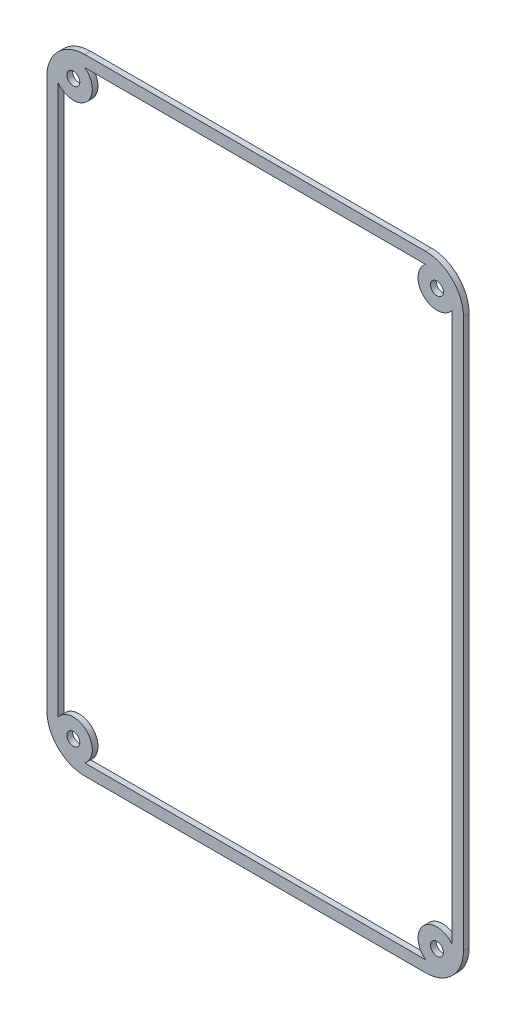
ISO-10303-21;
HEADER;
FILE_DESCRIPTION(('STEP AP214'),'2;1');
FILE_NAME('part.step','',(''),(''),'','','');
FILE_SCHEMA(('AUTOMOTIVE_DESIGN { 1 0 10303 214 1 1 1 1 }'));
ENDSEC;
DATA;
#1=APPLICATION_CONTEXT('core data for automotive mechanical design processes');
#2=APPLICATION_PROTOCOL_DEFINITION('international standard','automotive_design',2000,#1);
#3=PRODUCT_CONTEXT('',#1,'mechanical');
#4=PRODUCT('Part','Part','',(#3));
#5=PRODUCT_RELATED_PRODUCT_CATEGORY('part','',(#4));
#6=PRODUCT_DEFINITION_FORMATION('','',#4);
#7=PRODUCT_DEFINITION_CONTEXT('part definition',#1,'design');
#8=PRODUCT_DEFINITION('design','',#6,#7);
#9=PRODUCT_DEFINITION_SHAPE('','',#8);
#10=(LENGTH_UNIT() NAMED_UNIT(*) SI_UNIT(.MILLI.,.METRE.));
#11=(NAMED_UNIT(*) PLANE_ANGLE_UNIT() SI_UNIT($,.RADIAN.));
#12=(NAMED_UNIT(*) SI_UNIT($,.STERADIAN.) SOLID_ANGLE_UNIT());
#13=UNCERTAINTY_MEASURE_WITH_UNIT(LENGTH_MEASURE(1.E-05),#10,'distance_accuracy_value','');
#14=(GEOMETRIC_REPRESENTATION_CONTEXT(3) GLOBAL_UNCERTAINTY_ASSIGNED_CONTEXT((#13)) GLOBAL_UNIT_ASSIGNED_CONTEXT((#10,
#11,#12)) REPRESENTATION_CONTEXT('',''));
#15=CARTESIAN_POINT('',(0.,0.,0.));
#16=DIRECTION('',(0.,0.,1.));
#17=DIRECTION('',(1.,0.,0.));
#18=AXIS2_PLACEMENT_3D('',#15,#16,#17);
#19=CARTESIAN_POINT('',(-45.,-72.5,1.5));
#20=DIRECTION('',(0.,0.,1.));
#21=DIRECTION('',(1.,0.,0.));
#22=AXIS2_PLACEMENT_3D('',#19,#20,#21);
#23=PLANE('',#22);
#24=CARTESIAN_POINT('',(-48.,75.5,1.5));
#25=DIRECTION('',(0.,0.,1.));
#26=DIRECTION('',(1.,0.,0.));
#27=AXIS2_PLACEMENT_3D('',#24,#25,#26);
#28=CIRCLE('',#27,1.7);
#29=CARTESIAN_POINT('',(-46.3,75.5,1.5));
#30=VERTEX_POINT('',#29);
#31=EDGE_CURVE('E592',#30,#30,#28,.T.);
#32=ORIENTED_EDGE('',*,*,#31,.F.);
#33=EDGE_LOOP('',(#32));
#34=FACE_BOUND('',#33,.T.);
#35=CARTESIAN_POINT('',(48.,-75.5,1.5));
#36=DIRECTION('',(0.,0.,1.));
#37=DIRECTION('',(1.,0.,0.));
#38=AXIS2_PLACEMENT_3D('',#35,#36,#37);
#39=CIRCLE('',#38,1.7);
#40=CARTESIAN_POINT('',(49.7,-75.5,1.5));
#41=VERTEX_POINT('',#40);
#42=EDGE_CURVE('E595',#41,#41,#39,.T.);
#43=ORIENTED_EDGE('',*,*,#42,.F.);
#44=EDGE_LOOP('',(#43));
#45=FACE_BOUND('',#44,.T.);
#46=CARTESIAN_POINT('',(48.,75.5,1.5));
#47=DIRECTION('',(0.,0.,1.));
#48=DIRECTION('',(1.,0.,0.));
#49=AXIS2_PLACEMENT_3D('',#46,#47,#48);
#50=CIRCLE('',#49,1.7);
#51=CARTESIAN_POINT('',(49.7,75.5,1.5));
#52=VERTEX_POINT('',#51);
#53=EDGE_CURVE('E605',#52,#52,#50,.T.);
#54=ORIENTED_EDGE('',*,*,#53,.F.);
#55=EDGE_LOOP('',(#54));
#56=FACE_BOUND('',#55,.T.);
#57=CARTESIAN_POINT('',(-48.,-75.5,1.5));
#58=DIRECTION('',(0.,0.,1.));
#59=DIRECTION('',(1.,0.,0.));
#60=AXIS2_PLACEMENT_3D('',#57,#58,#59);
#61=CIRCLE('',#60,1.7);
#62=CARTESIAN_POINT('',(-46.3,-75.5,1.5));
#63=VERTEX_POINT('',#62);
#64=EDGE_CURVE('E185',#63,#63,#61,.T.);
#65=ORIENTED_EDGE('',*,*,#64,.F.);
#66=EDGE_LOOP('',(#65));
#67=FACE_BOUND('',#66,.T.);
#68=CARTESIAN_POINT('',(-45.,-72.5,1.5));
#69=DIRECTION('',(0.,0.,1.));
#70=DIRECTION('',(1.,0.,0.));
#71=AXIS2_PLACEMENT_3D('',#68,#69,#70);
#72=CIRCLE('',#71,10.);
#73=CARTESIAN_POINT('',(-55.,-72.5,1.5));
#74=VERTEX_POINT('',#73);
#75=CARTESIAN_POINT('',(-45.,-82.5,1.5));
#76=VERTEX_POINT('',#75);
#77=EDGE_CURVE('E226',#74,#76,#72,.T.);
#78=ORIENTED_EDGE('',*,*,#77,.T.);
#79=DIRECTION('',(1.,0.,0.));
#80=VECTOR('',#79,1.);
#81=CARTESIAN_POINT('',(-45.,-82.5,1.5));
#82=LINE('',#81,#80);
#83=CARTESIAN_POINT('',(45.,-82.5,1.5));
#84=VERTEX_POINT('',#83);
#85=EDGE_CURVE('E229',#76,#84,#82,.T.);
#86=ORIENTED_EDGE('',*,*,#85,.T.);
#87=CARTESIAN_POINT('',(45.,-72.5,1.5));
#88=DIRECTION('',(0.,0.,1.));
#89=DIRECTION('',(1.,0.,0.));
#90=AXIS2_PLACEMENT_3D('',#87,#88,#89);
#91=CIRCLE('',#90,10.);
#92=CARTESIAN_POINT('',(55.,-72.5,1.5));
#93=VERTEX_POINT('',#92);
#94=EDGE_CURVE('E232',#84,#93,#91,.T.);
#95=ORIENTED_EDGE('',*,*,#94,.T.);
#96=DIRECTION('',(0.,1.,0.));
#97=VECTOR('',#96,1.);
#98=CARTESIAN_POINT('',(55.,-72.5,1.5));
#99=LINE('',#98,#97);
#100=CARTESIAN_POINT('',(55.,72.5,1.5));
#101=VERTEX_POINT('',#100);
#102=EDGE_CURVE('E234',#93,#101,#99,.T.);
#103=ORIENTED_EDGE('',*,*,#102,.T.);
#104=CARTESIAN_POINT('',(45.,72.5,1.5));
#105=DIRECTION('',(0.,0.,1.));
#106=DIRECTION('',(1.,0.,0.));
#107=AXIS2_PLACEMENT_3D('',#104,#105,#106);
#108=CIRCLE('',#107,10.);
#109=CARTESIAN_POINT('',(45.,82.5,1.5));
#110=VERTEX_POINT('',#109);
#111=EDGE_CURVE('E236',#101,#110,#108,.T.);
#112=ORIENTED_EDGE('',*,*,#111,.T.);
#113=DIRECTION('',(-1.,0.,0.));
#114=VECTOR('',#113,1.);
#115=CARTESIAN_POINT('',(45.,82.5,1.5));
#116=LINE('',#115,#114);
#117=CARTESIAN_POINT('',(-45.,82.5,1.5));
#118=VERTEX_POINT('',#117);
#119=EDGE_CURVE('E238',#110,#118,#116,.T.);
#120=ORIENTED_EDGE('',*,*,#119,.T.);
#121=CARTESIAN_POINT('',(-45.,72.5,1.5));
#122=DIRECTION('',(0.,0.,1.));
#123=DIRECTION('',(1.,0.,0.));
#124=AXIS2_PLACEMENT_3D('',#121,#122,#123);
#125=CIRCLE('',#124,10.);
#126=CARTESIAN_POINT('',(-55.,72.5,1.5));
#127=VERTEX_POINT('',#126);
#128=EDGE_CURVE('E240',#118,#127,#125,.T.);
#129=ORIENTED_EDGE('',*,*,#128,.T.);
#130=DIRECTION('',(0.,-1.,0.));
#131=VECTOR('',#130,1.);
#132=CARTESIAN_POINT('',(-55.,72.5,1.5));
#133=LINE('',#132,#131);
#134=EDGE_CURVE('E242',#127,#74,#133,.T.);
#135=ORIENTED_EDGE('',*,*,#134,.T.);
#136=EDGE_LOOP('',(#78,#86,#95,#103,#112,#120,#129,#135));
#137=FACE_BOUND('',#136,.T.);
#138=DIRECTION('',(-1.,0.,0.));
#139=VECTOR('',#138,1.);
#140=CARTESIAN_POINT('',(45.,79.5,1.5));
#141=LINE('',#140,#139);
#142=CARTESIAN_POINT('',(45.,79.5,1.5));
#143=VERTEX_POINT('',#142);
#144=CARTESIAN_POINT('',(-45.,79.5,1.5));
#145=VERTEX_POINT('',#144);
#146=EDGE_CURVE('E204',#143,#145,#141,.T.);
#147=ORIENTED_EDGE('',*,*,#146,.F.);
#148=CARTESIAN_POINT('',(48.,75.5,1.5));
#149=DIRECTION('',(0.,0.,1.));
#150=DIRECTION('',(1.,0.,0.));
#151=AXIS2_PLACEMENT_3D('',#148,#149,#150);
#152=CIRCLE('',#151,5.);
#153=CARTESIAN_POINT('',(52.,72.5,1.5));
#154=VERTEX_POINT('',#153);
#155=EDGE_CURVE('E170',#143,#154,#152,.T.);
#156=ORIENTED_EDGE('',*,*,#155,.T.);
#157=DIRECTION('',(0.,1.,0.));
#158=VECTOR('',#157,1.);
#159=CARTESIAN_POINT('',(52.,-72.5,1.5));
#160=LINE('',#159,#158);
#161=CARTESIAN_POINT('',(52.,-72.5,1.5));
#162=VERTEX_POINT('',#161);
#163=EDGE_CURVE('E202',#162,#154,#160,.T.);
#164=ORIENTED_EDGE('',*,*,#163,.F.);
#165=CARTESIAN_POINT('',(48.,-75.5,1.5));
#166=DIRECTION('',(0.,0.,1.));
#167=DIRECTION('',(1.,0.,0.));
#168=AXIS2_PLACEMENT_3D('',#165,#166,#167);
#169=CIRCLE('',#168,5.);
#170=CARTESIAN_POINT('',(45.,-79.5,1.5));
#171=VERTEX_POINT('',#170);
#172=EDGE_CURVE('E177',#162,#171,#169,.T.);
#173=ORIENTED_EDGE('',*,*,#172,.T.);
#174=DIRECTION('',(1.,0.,0.));
#175=VECTOR('',#174,1.);
#176=CARTESIAN_POINT('',(-45.,-79.5,1.5));
#177=LINE('',#176,#175);
#178=CARTESIAN_POINT('',(-45.,-79.5,1.5));
#179=VERTEX_POINT('',#178);
#180=EDGE_CURVE('E200',#179,#171,#177,.T.);
#181=ORIENTED_EDGE('',*,*,#180,.F.);
#182=CARTESIAN_POINT('',(-48.,-75.5,1.5));
#183=DIRECTION('',(0.,0.,1.));
#184=DIRECTION('',(1.,0.,0.));
#185=AXIS2_PLACEMENT_3D('',#182,#183,#184);
#186=CIRCLE('',#185,5.);
#187=CARTESIAN_POINT('',(-52.,-72.5,1.5));
#188=VERTEX_POINT('',#187);
#189=EDGE_CURVE('E195',#179,#188,#186,.T.);
#190=ORIENTED_EDGE('',*,*,#189,.T.);
#191=DIRECTION('',(0.,-1.,0.));
#192=VECTOR('',#191,1.);
#193=CARTESIAN_POINT('',(-52.,72.5,1.5));
#194=LINE('',#193,#192);
#195=CARTESIAN_POINT('',(-52.,72.5,1.5));
#196=VERTEX_POINT('',#195);
#197=EDGE_CURVE('E206',#196,#188,#194,.T.);
#198=ORIENTED_EDGE('',*,*,#197,.F.);
#199=CARTESIAN_POINT('',(-48.,75.5,1.5));
#200=DIRECTION('',(0.,0.,1.));
#201=DIRECTION('',(1.,0.,0.));
#202=AXIS2_PLACEMENT_3D('',#199,#200,#201);
#203=CIRCLE('',#202,5.);
#204=EDGE_CURVE('E189',#196,#145,#203,.T.);
#205=ORIENTED_EDGE('',*,*,#204,.T.);
#206=EDGE_LOOP('',(#147,#156,#164,#173,#181,#190,#198,#205));
#207=FACE_BOUND('',#206,.T.);
#208=ADVANCED_FACE('F36',(#34,#45,#56,#67,#137,#207),#23,.T.);
#209=CARTESIAN_POINT('',(-45.,-72.5,0.));
#210=DIRECTION('',(0.,0.,1.));
#211=DIRECTION('',(1.,0.,0.));
#212=AXIS2_PLACEMENT_3D('',#209,#210,#211);
#213=PLANE('',#212);
#214=CARTESIAN_POINT('',(-48.,75.5,0.));
#215=DIRECTION('',(0.,0.,1.));
#216=DIRECTION('',(1.,0.,0.));
#217=AXIS2_PLACEMENT_3D('',#214,#215,#216);
#218=CIRCLE('',#217,1.7);
#219=CARTESIAN_POINT('',(-46.3,75.5,0.));
#220=VERTEX_POINT('',#219);
#221=EDGE_CURVE('E590',#220,#220,#218,.T.);
#222=ORIENTED_EDGE('',*,*,#221,.T.);
#223=EDGE_LOOP('',(#222));
#224=FACE_BOUND('',#223,.T.);
#225=CARTESIAN_POINT('',(48.,-75.5,0.));
#226=DIRECTION('',(0.,0.,1.));
#227=DIRECTION('',(1.,0.,0.));
#228=AXIS2_PLACEMENT_3D('',#225,#226,#227);
#229=CIRCLE('',#228,1.7);
#230=CARTESIAN_POINT('',(49.7,-75.5,0.));
#231=VERTEX_POINT('',#230);
#232=EDGE_CURVE('E603',#231,#231,#229,.T.);
#233=ORIENTED_EDGE('',*,*,#232,.T.);
#234=EDGE_LOOP('',(#233));
#235=FACE_BOUND('',#234,.T.);
#236=CARTESIAN_POINT('',(48.,75.5,0.));
#237=DIRECTION('',(0.,0.,1.));
#238=DIRECTION('',(1.,0.,0.));
#239=AXIS2_PLACEMENT_3D('',#236,#237,#238);
#240=CIRCLE('',#239,1.7);
#241=CARTESIAN_POINT('',(49.7,75.5,0.));
#242=VERTEX_POINT('',#241);
#243=EDGE_CURVE('E598',#242,#242,#240,.T.);
#244=ORIENTED_EDGE('',*,*,#243,.T.);
#245=EDGE_LOOP('',(#244));
#246=FACE_BOUND('',#245,.T.);
#247=CARTESIAN_POINT('',(-48.,-75.5,0.));
#248=DIRECTION('',(0.,0.,1.));
#249=DIRECTION('',(1.,0.,0.));
#250=AXIS2_PLACEMENT_3D('',#247,#248,#249);
#251=CIRCLE('',#250,1.7);
#252=CARTESIAN_POINT('',(-46.3,-75.5,0.));
#253=VERTEX_POINT('',#252);
#254=EDGE_CURVE('E182',#253,#253,#251,.T.);
#255=ORIENTED_EDGE('',*,*,#254,.T.);
#256=EDGE_LOOP('',(#255));
#257=FACE_BOUND('',#256,.T.);
#258=DIRECTION('',(0.,1.,0.));
#259=VECTOR('',#258,1.);
#260=CARTESIAN_POINT('',(52.,-72.5,0.));
#261=LINE('',#260,#259);
#262=CARTESIAN_POINT('',(52.,-72.5,0.));
#263=VERTEX_POINT('',#262);
#264=CARTESIAN_POINT('',(52.,72.5,0.));
#265=VERTEX_POINT('',#264);
#266=EDGE_CURVE('E161',#263,#265,#261,.T.);
#267=ORIENTED_EDGE('',*,*,#266,.T.);
#268=CARTESIAN_POINT('',(48.,75.5,0.));
#269=DIRECTION('',(0.,0.,1.));
#270=DIRECTION('',(1.,0.,0.));
#271=AXIS2_PLACEMENT_3D('',#268,#269,#270);
#272=CIRCLE('',#271,5.);
#273=CARTESIAN_POINT('',(45.,79.5,0.));
#274=VERTEX_POINT('',#273);
#275=EDGE_CURVE('E168',#274,#265,#272,.T.);
#276=ORIENTED_EDGE('',*,*,#275,.F.);
#277=DIRECTION('',(-1.,0.,0.));
#278=VECTOR('',#277,1.);
#279=CARTESIAN_POINT('',(45.,79.5,0.));
#280=LINE('',#279,#278);
#281=CARTESIAN_POINT('',(-45.,79.5,0.));
#282=VERTEX_POINT('',#281);
#283=EDGE_CURVE('E149',#274,#282,#280,.T.);
#284=ORIENTED_EDGE('',*,*,#283,.T.);
#285=CARTESIAN_POINT('',(-48.,75.5,0.));
#286=DIRECTION('',(0.,0.,1.));
#287=DIRECTION('',(1.,0.,0.));
#288=AXIS2_PLACEMENT_3D('',#285,#286,#287);
#289=CIRCLE('',#288,5.);
#290=CARTESIAN_POINT('',(-52.,72.5,0.));
#291=VERTEX_POINT('',#290);
#292=EDGE_CURVE('E191',#291,#282,#289,.T.);
#293=ORIENTED_EDGE('',*,*,#292,.F.);
#294=DIRECTION('',(0.,-1.,0.));
#295=VECTOR('',#294,1.);
#296=CARTESIAN_POINT('',(-52.,72.5,0.));
#297=LINE('',#296,#295);
#298=CARTESIAN_POINT('',(-52.,-72.5,0.));
#299=VERTEX_POINT('',#298);
#300=EDGE_CURVE('E160',#291,#299,#297,.T.);
#301=ORIENTED_EDGE('',*,*,#300,.T.);
#302=CARTESIAN_POINT('',(-48.,-75.5,0.));
#303=DIRECTION('',(0.,0.,1.));
#304=DIRECTION('',(1.,0.,0.));
#305=AXIS2_PLACEMENT_3D('',#302,#303,#304);
#306=CIRCLE('',#305,5.);
#307=CARTESIAN_POINT('',(-45.,-79.5,0.));
#308=VERTEX_POINT('',#307);
#309=EDGE_CURVE('E59',#308,#299,#306,.T.);
#310=ORIENTED_EDGE('',*,*,#309,.F.);
#311=DIRECTION('',(1.,0.,0.));
#312=VECTOR('',#311,1.);
#313=CARTESIAN_POINT('',(-45.,-79.5,0.));
#314=LINE('',#313,#312);
#315=CARTESIAN_POINT('',(45.,-79.5,0.));
#316=VERTEX_POINT('',#315);
#317=EDGE_CURVE('E198',#308,#316,#314,.T.);
#318=ORIENTED_EDGE('',*,*,#317,.T.);
#319=CARTESIAN_POINT('',(48.,-75.5,0.));
#320=DIRECTION('',(0.,0.,1.));
#321=DIRECTION('',(1.,0.,0.));
#322=AXIS2_PLACEMENT_3D('',#319,#320,#321);
#323=CIRCLE('',#322,5.);
#324=EDGE_CURVE('E180',#263,#316,#323,.T.);
#325=ORIENTED_EDGE('',*,*,#324,.F.);
#326=EDGE_LOOP('',(#267,#276,#284,#293,#301,#310,#318,#325));
#327=FACE_BOUND('',#326,.T.);
#328=CARTESIAN_POINT('',(-45.,-72.5,0.));
#329=DIRECTION('',(0.,0.,1.));
#330=DIRECTION('',(1.,0.,0.));
#331=AXIS2_PLACEMENT_3D('',#328,#329,#330);
#332=CIRCLE('',#331,10.);
#333=CARTESIAN_POINT('',(-55.,-72.5,0.));
#334=VERTEX_POINT('',#333);
#335=CARTESIAN_POINT('',(-45.,-82.5,0.));
#336=VERTEX_POINT('',#335);
#337=EDGE_CURVE('E225',#334,#336,#332,.T.);
#338=ORIENTED_EDGE('',*,*,#337,.F.);
#339=DIRECTION('',(0.,-1.,0.));
#340=VECTOR('',#339,1.);
#341=CARTESIAN_POINT('',(-55.,72.5,0.));
#342=LINE('',#341,#340);
#343=CARTESIAN_POINT('',(-55.,72.5,0.));
#344=VERTEX_POINT('',#343);
#345=EDGE_CURVE('E230',#344,#334,#342,.T.);
#346=ORIENTED_EDGE('',*,*,#345,.F.);
#347=CARTESIAN_POINT('',(-45.,72.5,0.));
#348=DIRECTION('',(0.,0.,1.));
#349=DIRECTION('',(1.,0.,0.));
#350=AXIS2_PLACEMENT_3D('',#347,#348,#349);
#351=CIRCLE('',#350,10.);
#352=CARTESIAN_POINT('',(-45.,82.5,0.));
#353=VERTEX_POINT('',#352);
#354=EDGE_CURVE('E257',#353,#344,#351,.T.);
#355=ORIENTED_EDGE('',*,*,#354,.F.);
#356=DIRECTION('',(-1.,0.,0.));
#357=VECTOR('',#356,1.);
#358=CARTESIAN_POINT('',(45.,82.5,0.));
#359=LINE('',#358,#357);
#360=CARTESIAN_POINT('',(45.,82.5,0.));
#361=VERTEX_POINT('',#360);
#362=EDGE_CURVE('E255',#361,#353,#359,.T.);
#363=ORIENTED_EDGE('',*,*,#362,.F.);
#364=CARTESIAN_POINT('',(45.,72.5,0.));
#365=DIRECTION('',(0.,0.,1.));
#366=DIRECTION('',(1.,0.,0.));
#367=AXIS2_PLACEMENT_3D('',#364,#365,#366);
#368=CIRCLE('',#367,10.);
#369=CARTESIAN_POINT('',(55.,72.5,0.));
#370=VERTEX_POINT('',#369);
#371=EDGE_CURVE('E253',#370,#361,#368,.T.);
#372=ORIENTED_EDGE('',*,*,#371,.F.);
#373=DIRECTION('',(0.,1.,0.));
#374=VECTOR('',#373,1.);
#375=CARTESIAN_POINT('',(55.,-72.5,0.));
#376=LINE('',#375,#374);
#377=CARTESIAN_POINT('',(55.,-72.5,0.));
#378=VERTEX_POINT('',#377);
#379=EDGE_CURVE('E251',#378,#370,#376,.T.);
#380=ORIENTED_EDGE('',*,*,#379,.F.);
#381=CARTESIAN_POINT('',(45.,-72.5,0.));
#382=DIRECTION('',(0.,0.,1.));
#383=DIRECTION('',(1.,0.,0.));
#384=AXIS2_PLACEMENT_3D('',#381,#382,#383);
#385=CIRCLE('',#384,10.);
#386=CARTESIAN_POINT('',(45.,-82.5,0.));
#387=VERTEX_POINT('',#386);
#388=EDGE_CURVE('E249',#387,#378,#385,.T.);
#389=ORIENTED_EDGE('',*,*,#388,.F.);
#390=DIRECTION('',(1.,0.,0.));
#391=VECTOR('',#390,1.);
#392=CARTESIAN_POINT('',(-45.,-82.5,0.));
#393=LINE('',#392,#391);
#394=EDGE_CURVE('E247',#336,#387,#393,.T.);
#395=ORIENTED_EDGE('',*,*,#394,.F.);
#396=EDGE_LOOP('',(#338,#346,#355,#363,#372,#380,#389,#395));
#397=FACE_BOUND('',#396,.T.);
#398=ADVANCED_FACE('F174',(#224,#235,#246,#257,#327,#397),#213,.F.);
#399=CARTESIAN_POINT('',(-45.,-72.5,1.5));
#400=DIRECTION('',(0.,0.,-1.));
#401=DIRECTION('',(-1.,0.,0.));
#402=AXIS2_PLACEMENT_3D('',#399,#400,#401);
#403=CYLINDRICAL_SURFACE('',#402,10.);
#404=ORIENTED_EDGE('',*,*,#337,.T.);
#405=DIRECTION('',(0.,0.,-1.));
#406=VECTOR('',#405,1.);
#407=CARTESIAN_POINT('',(-45.,-82.5,1.5));
#408=LINE('',#407,#406);
#409=EDGE_CURVE('E11',#76,#336,#408,.T.);
#410=ORIENTED_EDGE('',*,*,#409,.F.);
#411=ORIENTED_EDGE('',*,*,#77,.F.);
#412=DIRECTION('',(0.,0.,-1.));
#413=VECTOR('',#412,1.);
#414=CARTESIAN_POINT('',(-55.,-72.5,1.5));
#415=LINE('',#414,#413);
#416=EDGE_CURVE('E244',#74,#334,#415,.T.);
#417=ORIENTED_EDGE('',*,*,#416,.T.);
#418=EDGE_LOOP('',(#404,#410,#411,#417));
#419=FACE_BOUND('',#418,.T.);
#420=ADVANCED_FACE('F38',(#419),#403,.T.);
#421=CARTESIAN_POINT('',(-45.,-82.5,1.5));
#422=DIRECTION('',(0.,1.,0.));
#423=DIRECTION('',(0.,0.,1.));
#424=AXIS2_PLACEMENT_3D('',#421,#422,#423);
#425=PLANE('',#424);
#426=ORIENTED_EDGE('',*,*,#394,.T.);
#427=DIRECTION('',(0.,0.,-1.));
#428=VECTOR('',#427,1.);
#429=CARTESIAN_POINT('',(45.,-82.5,1.5));
#430=LINE('',#429,#428);
#431=EDGE_CURVE('E44',#84,#387,#430,.T.);
#432=ORIENTED_EDGE('',*,*,#431,.F.);
#433=ORIENTED_EDGE('',*,*,#85,.F.);
#434=ORIENTED_EDGE('',*,*,#409,.T.);
#435=EDGE_LOOP('',(#426,#432,#433,#434));
#436=FACE_BOUND('',#435,.T.);
#437=ADVANCED_FACE('F302',(#436),#425,.F.);
#438=CARTESIAN_POINT('',(45.,-72.5,1.5));
#439=DIRECTION('',(0.,0.,-1.));
#440=DIRECTION('',(-1.,0.,0.));
#441=AXIS2_PLACEMENT_3D('',#438,#439,#440);
#442=CYLINDRICAL_SURFACE('',#441,10.);
#443=ORIENTED_EDGE('',*,*,#388,.T.);
#444=DIRECTION('',(0.,0.,-1.));
#445=VECTOR('',#444,1.);
#446=CARTESIAN_POINT('',(55.,-72.5,1.5));
#447=LINE('',#446,#445);
#448=EDGE_CURVE('E274',#93,#378,#447,.T.);
#449=ORIENTED_EDGE('',*,*,#448,.F.);
#450=ORIENTED_EDGE('',*,*,#94,.F.);
#451=ORIENTED_EDGE('',*,*,#431,.T.);
#452=EDGE_LOOP('',(#443,#449,#450,#451));
#453=FACE_BOUND('',#452,.T.);
#454=ADVANCED_FACE('F281',(#453),#442,.T.);
#455=CARTESIAN_POINT('',(55.,-72.5,1.5));
#456=DIRECTION('',(-1.,0.,0.));
#457=DIRECTION('',(0.,0.,1.));
#458=AXIS2_PLACEMENT_3D('',#455,#456,#457);
#459=PLANE('',#458);
#460=ORIENTED_EDGE('',*,*,#379,.T.);
#461=DIRECTION('',(0.,0.,-1.));
#462=VECTOR('',#461,1.);
#463=CARTESIAN_POINT('',(55.,72.5,1.5));
#464=LINE('',#463,#462);
#465=EDGE_CURVE('E271',#101,#370,#464,.T.);
#466=ORIENTED_EDGE('',*,*,#465,.F.);
#467=ORIENTED_EDGE('',*,*,#102,.F.);
#468=ORIENTED_EDGE('',*,*,#448,.T.);
#469=EDGE_LOOP('',(#460,#466,#467,#468));
#470=FACE_BOUND('',#469,.T.);
#471=ADVANCED_FACE('F290',(#470),#459,.F.);
#472=CARTESIAN_POINT('',(45.,72.5,1.5));
#473=DIRECTION('',(0.,0.,-1.));
#474=DIRECTION('',(-1.,0.,0.));
#475=AXIS2_PLACEMENT_3D('',#472,#473,#474);
#476=CYLINDRICAL_SURFACE('',#475,10.);
#477=ORIENTED_EDGE('',*,*,#371,.T.);
#478=DIRECTION('',(0.,0.,-1.));
#479=VECTOR('',#478,1.);
#480=CARTESIAN_POINT('',(45.,82.5,1.5));
#481=LINE('',#480,#479);
#482=EDGE_CURVE('E268',#110,#361,#481,.T.);
#483=ORIENTED_EDGE('',*,*,#482,.F.);
#484=ORIENTED_EDGE('',*,*,#111,.F.);
#485=ORIENTED_EDGE('',*,*,#465,.T.);
#486=EDGE_LOOP('',(#477,#483,#484,#485));
#487=FACE_BOUND('',#486,.T.);
#488=ADVANCED_FACE('F294',(#487),#476,.T.);
#489=CARTESIAN_POINT('',(45.,82.5,1.5));
#490=DIRECTION('',(0.,-1.,0.));
#491=DIRECTION('',(0.,0.,-1.));
#492=AXIS2_PLACEMENT_3D('',#489,#490,#491);
#493=PLANE('',#492);
#494=ORIENTED_EDGE('',*,*,#362,.T.);
#495=DIRECTION('',(0.,0.,-1.));
#496=VECTOR('',#495,1.);
#497=CARTESIAN_POINT('',(-45.,82.5,1.5));
#498=LINE('',#497,#496);
#499=EDGE_CURVE('E265',#118,#353,#498,.T.);
#500=ORIENTED_EDGE('',*,*,#499,.F.);
#501=ORIENTED_EDGE('',*,*,#119,.F.);
#502=ORIENTED_EDGE('',*,*,#482,.T.);
#503=EDGE_LOOP('',(#494,#500,#501,#502));
#504=FACE_BOUND('',#503,.T.);
#505=ADVANCED_FACE('F315',(#504),#493,.F.);
#506=CARTESIAN_POINT('',(-45.,72.5,1.5));
#507=DIRECTION('',(0.,0.,-1.));
#508=DIRECTION('',(-1.,0.,0.));
#509=AXIS2_PLACEMENT_3D('',#506,#507,#508);
#510=CYLINDRICAL_SURFACE('',#509,10.);
#511=ORIENTED_EDGE('',*,*,#354,.T.);
#512=DIRECTION('',(0.,0.,-1.));
#513=VECTOR('',#512,1.);
#514=CARTESIAN_POINT('',(-55.,72.5,1.5));
#515=LINE('',#514,#513);
#516=EDGE_CURVE('E262',#127,#344,#515,.T.);
#517=ORIENTED_EDGE('',*,*,#516,.F.);
#518=ORIENTED_EDGE('',*,*,#128,.F.);
#519=ORIENTED_EDGE('',*,*,#499,.T.);
#520=EDGE_LOOP('',(#511,#517,#518,#519));
#521=FACE_BOUND('',#520,.T.);
#522=ADVANCED_FACE('F313',(#521),#510,.T.);
#523=CARTESIAN_POINT('',(-55.,72.5,1.5));
#524=DIRECTION('',(1.,0.,0.));
#525=DIRECTION('',(0.,0.,-1.));
#526=AXIS2_PLACEMENT_3D('',#523,#524,#525);
#527=PLANE('',#526);
#528=ORIENTED_EDGE('',*,*,#345,.T.);
#529=ORIENTED_EDGE('',*,*,#416,.F.);
#530=ORIENTED_EDGE('',*,*,#134,.F.);
#531=ORIENTED_EDGE('',*,*,#516,.T.);
#532=EDGE_LOOP('',(#528,#529,#530,#531));
#533=FACE_BOUND('',#532,.T.);
#534=ADVANCED_FACE('F308',(#533),#527,.F.);
#535=CARTESIAN_POINT('',(-45.,-79.5,1.5));
#536=DIRECTION('',(0.,1.,0.));
#537=DIRECTION('',(0.,0.,1.));
#538=AXIS2_PLACEMENT_3D('',#535,#536,#537);
#539=PLANE('',#538);
#540=ORIENTED_EDGE('',*,*,#317,.F.);
#541=DIRECTION('',(0.,0.,-1.));
#542=VECTOR('',#541,1.);
#543=CARTESIAN_POINT('',(-45.,-79.5,1.5));
#544=LINE('',#543,#542);
#545=EDGE_CURVE('E223',#179,#308,#544,.T.);
#546=ORIENTED_EDGE('',*,*,#545,.F.);
#547=ORIENTED_EDGE('',*,*,#180,.T.);
#548=DIRECTION('',(0.,0.,-1.));
#549=VECTOR('',#548,1.);
#550=CARTESIAN_POINT('',(45.,-79.5,1.5));
#551=LINE('',#550,#549);
#552=EDGE_CURVE('E221',#171,#316,#551,.T.);
#553=ORIENTED_EDGE('',*,*,#552,.T.);
#554=EDGE_LOOP('',(#540,#546,#547,#553));
#555=FACE_BOUND('',#554,.T.);
#556=ADVANCED_FACE('F335',(#555),#539,.T.);
#557=CARTESIAN_POINT('',(52.,-72.5,1.5));
#558=DIRECTION('',(-1.,0.,0.));
#559=DIRECTION('',(0.,0.,1.));
#560=AXIS2_PLACEMENT_3D('',#557,#558,#559);
#561=PLANE('',#560);
#562=ORIENTED_EDGE('',*,*,#266,.F.);
#563=DIRECTION('',(0.,0.,-1.));
#564=VECTOR('',#563,1.);
#565=CARTESIAN_POINT('',(52.,-72.5,1.5));
#566=LINE('',#565,#564);
#567=EDGE_CURVE('E218',#162,#263,#566,.T.);
#568=ORIENTED_EDGE('',*,*,#567,.F.);
#569=ORIENTED_EDGE('',*,*,#163,.T.);
#570=DIRECTION('',(0.,0.,-1.));
#571=VECTOR('',#570,1.);
#572=CARTESIAN_POINT('',(52.,72.5,1.5));
#573=LINE('',#572,#571);
#574=EDGE_CURVE('E171',#154,#265,#573,.T.);
#575=ORIENTED_EDGE('',*,*,#574,.T.);
#576=EDGE_LOOP('',(#562,#568,#569,#575));
#577=FACE_BOUND('',#576,.T.);
#578=ADVANCED_FACE('F342',(#577),#561,.T.);
#579=CARTESIAN_POINT('',(45.,79.5,1.5));
#580=DIRECTION('',(0.,-1.,0.));
#581=DIRECTION('',(0.,0.,-1.));
#582=AXIS2_PLACEMENT_3D('',#579,#580,#581);
#583=PLANE('',#582);
#584=ORIENTED_EDGE('',*,*,#283,.F.);
#585=DIRECTION('',(0.,0.,-1.));
#586=VECTOR('',#585,1.);
#587=CARTESIAN_POINT('',(45.,79.5,1.5));
#588=LINE('',#587,#586);
#589=EDGE_CURVE('E152',#143,#274,#588,.T.);
#590=ORIENTED_EDGE('',*,*,#589,.F.);
#591=ORIENTED_EDGE('',*,*,#146,.T.);
#592=DIRECTION('',(0.,0.,-1.));
#593=VECTOR('',#592,1.);
#594=CARTESIAN_POINT('',(-45.,79.5,1.5));
#595=LINE('',#594,#593);
#596=EDGE_CURVE('E155',#145,#282,#595,.T.);
#597=ORIENTED_EDGE('',*,*,#596,.T.);
#598=EDGE_LOOP('',(#584,#590,#591,#597));
#599=FACE_BOUND('',#598,.T.);
#600=ADVANCED_FACE('F151',(#599),#583,.T.);
#601=CARTESIAN_POINT('',(-52.,72.5,1.5));
#602=DIRECTION('',(1.,0.,0.));
#603=DIRECTION('',(0.,0.,-1.));
#604=AXIS2_PLACEMENT_3D('',#601,#602,#603);
#605=PLANE('',#604);
#606=ORIENTED_EDGE('',*,*,#300,.F.);
#607=DIRECTION('',(0.,0.,-1.));
#608=VECTOR('',#607,1.);
#609=CARTESIAN_POINT('',(-52.,72.5,1.5));
#610=LINE('',#609,#608);
#611=EDGE_CURVE('E51',#196,#291,#610,.T.);
#612=ORIENTED_EDGE('',*,*,#611,.F.);
#613=ORIENTED_EDGE('',*,*,#197,.T.);
#614=DIRECTION('',(0.,0.,-1.));
#615=VECTOR('',#614,1.);
#616=CARTESIAN_POINT('',(-52.,-72.5,1.5));
#617=LINE('',#616,#615);
#618=EDGE_CURVE('E208',#188,#299,#617,.T.);
#619=ORIENTED_EDGE('',*,*,#618,.T.);
#620=EDGE_LOOP('',(#606,#612,#613,#619));
#621=FACE_BOUND('',#620,.T.);
#622=ADVANCED_FACE('F359',(#621),#605,.T.);
#623=CARTESIAN_POINT('',(-48.,-75.5,1.5));
#624=DIRECTION('',(0.,0.,-1.));
#625=DIRECTION('',(-1.,0.,0.));
#626=AXIS2_PLACEMENT_3D('',#623,#624,#625);
#627=CYLINDRICAL_SURFACE('',#626,5.);
#628=ORIENTED_EDGE('',*,*,#545,.T.);
#629=ORIENTED_EDGE('',*,*,#309,.T.);
#630=ORIENTED_EDGE('',*,*,#618,.F.);
#631=ORIENTED_EDGE('',*,*,#189,.F.);
#632=EDGE_LOOP('',(#628,#629,#630,#631));
#633=FACE_BOUND('',#632,.T.);
#634=ADVANCED_FACE('F360',(#633),#627,.T.);
#635=CARTESIAN_POINT('',(-48.,75.5,1.5));
#636=DIRECTION('',(0.,0.,-1.));
#637=DIRECTION('',(-1.,0.,0.));
#638=AXIS2_PLACEMENT_3D('',#635,#636,#637);
#639=CYLINDRICAL_SURFACE('',#638,5.);
#640=ORIENTED_EDGE('',*,*,#596,.F.);
#641=ORIENTED_EDGE('',*,*,#204,.F.);
#642=ORIENTED_EDGE('',*,*,#611,.T.);
#643=ORIENTED_EDGE('',*,*,#292,.T.);
#644=EDGE_LOOP('',(#640,#641,#642,#643));
#645=FACE_BOUND('',#644,.T.);
#646=ADVANCED_FACE('F358',(#645),#639,.T.);
#647=CARTESIAN_POINT('',(48.,-75.5,1.5));
#648=DIRECTION('',(0.,0.,-1.));
#649=DIRECTION('',(-1.,0.,0.));
#650=AXIS2_PLACEMENT_3D('',#647,#648,#649);
#651=CYLINDRICAL_SURFACE('',#650,5.);
#652=ORIENTED_EDGE('',*,*,#552,.F.);
#653=ORIENTED_EDGE('',*,*,#172,.F.);
#654=ORIENTED_EDGE('',*,*,#567,.T.);
#655=ORIENTED_EDGE('',*,*,#324,.T.);
#656=EDGE_LOOP('',(#652,#653,#654,#655));
#657=FACE_BOUND('',#656,.T.);
#658=ADVANCED_FACE('F353',(#657),#651,.T.);
#659=CARTESIAN_POINT('',(48.,75.5,1.5));
#660=DIRECTION('',(0.,0.,-1.));
#661=DIRECTION('',(-1.,0.,0.));
#662=AXIS2_PLACEMENT_3D('',#659,#660,#661);
#663=CYLINDRICAL_SURFACE('',#662,5.);
#664=ORIENTED_EDGE('',*,*,#574,.F.);
#665=ORIENTED_EDGE('',*,*,#155,.F.);
#666=ORIENTED_EDGE('',*,*,#589,.T.);
#667=ORIENTED_EDGE('',*,*,#275,.T.);
#668=EDGE_LOOP('',(#664,#665,#666,#667));
#669=FACE_BOUND('',#668,.T.);
#670=ADVANCED_FACE('F167',(#669),#663,.T.);
#671=CARTESIAN_POINT('',(-48.,-75.5,0.));
#672=DIRECTION('',(0.,0.,1.));
#673=DIRECTION('',(1.,0.,0.));
#674=AXIS2_PLACEMENT_3D('',#671,#672,#673);
#675=CYLINDRICAL_SURFACE('',#674,1.7);
#676=ORIENTED_EDGE('',*,*,#254,.F.);
#677=EDGE_LOOP('',(#676));
#678=FACE_BOUND('',#677,.T.);
#679=ORIENTED_EDGE('',*,*,#64,.T.);
#680=EDGE_LOOP('',(#679));
#681=FACE_BOUND('',#680,.T.);
#682=ADVANCED_FACE('F411',(#678,#681),#675,.F.);
#683=CARTESIAN_POINT('',(48.,75.5,0.));
#684=DIRECTION('',(0.,0.,1.));
#685=DIRECTION('',(1.,0.,0.));
#686=AXIS2_PLACEMENT_3D('',#683,#684,#685);
#687=CYLINDRICAL_SURFACE('',#686,1.7);
#688=ORIENTED_EDGE('',*,*,#243,.F.);
#689=EDGE_LOOP('',(#688));
#690=FACE_BOUND('',#689,.T.);
#691=ORIENTED_EDGE('',*,*,#53,.T.);
#692=EDGE_LOOP('',(#691));
#693=FACE_BOUND('',#692,.T.);
#694=ADVANCED_FACE('F435',(#690,#693),#687,.F.);
#695=CARTESIAN_POINT('',(48.,-75.5,0.));
#696=DIRECTION('',(0.,0.,1.));
#697=DIRECTION('',(1.,0.,0.));
#698=AXIS2_PLACEMENT_3D('',#695,#696,#697);
#699=CYLINDRICAL_SURFACE('',#698,1.7);
#700=ORIENTED_EDGE('',*,*,#232,.F.);
#701=EDGE_LOOP('',(#700));
#702=FACE_BOUND('',#701,.T.);
#703=ORIENTED_EDGE('',*,*,#42,.T.);
#704=EDGE_LOOP('',(#703));
#705=FACE_BOUND('',#704,.T.);
#706=ADVANCED_FACE('F446',(#702,#705),#699,.F.);
#707=CARTESIAN_POINT('',(-48.,75.5,0.));
#708=DIRECTION('',(0.,0.,1.));
#709=DIRECTION('',(1.,0.,0.));
#710=AXIS2_PLACEMENT_3D('',#707,#708,#709);
#711=CYLINDRICAL_SURFACE('',#710,1.7);
#712=ORIENTED_EDGE('',*,*,#221,.F.);
#713=EDGE_LOOP('',(#712));
#714=FACE_BOUND('',#713,.T.);
#715=ORIENTED_EDGE('',*,*,#31,.T.);
#716=EDGE_LOOP('',(#715));
#717=FACE_BOUND('',#716,.T.);
#718=ADVANCED_FACE('F457',(#714,#717),#711,.F.);
#719=CLOSED_SHELL('',(#208,#398,#420,#437,#454,#471,#488,#505,#522,#534,#556,#578,#600,#622,
#634,#646,#658,#670,#682,#694,#706,#718));
#720=MANIFOLD_SOLID_BREP('B2',#719);
#721=ADVANCED_BREP_SHAPE_REPRESENTATION('',(#18,#720),#14);
#722=SHAPE_DEFINITION_REPRESENTATION(#9,#721);
ENDSEC;
END-ISO-10303-21;
